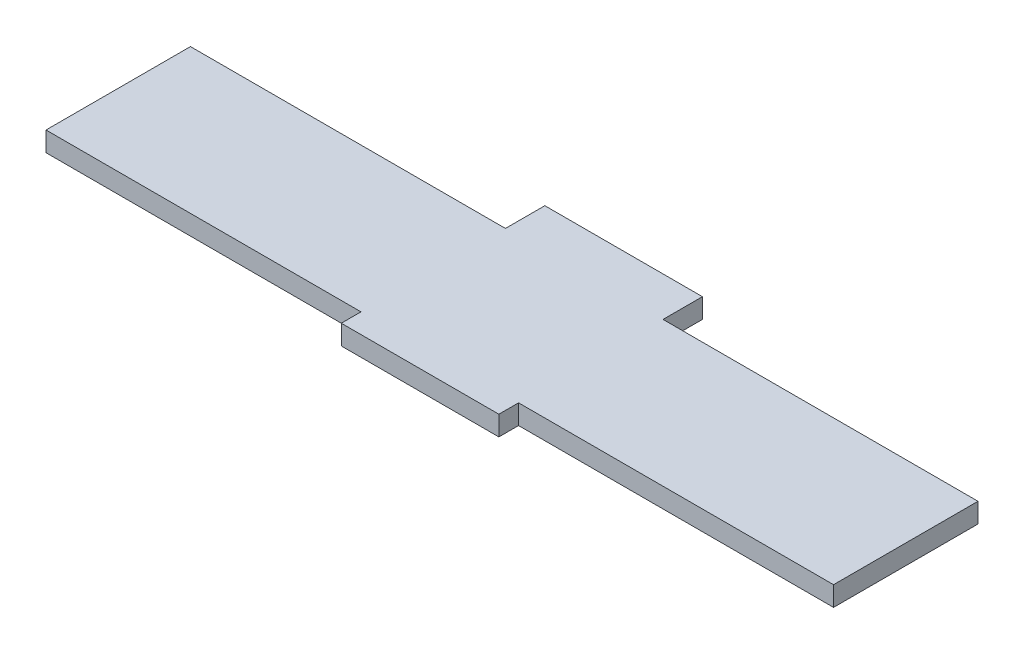
ISO-10303-21;
HEADER;
FILE_DESCRIPTION(('STEP AP214'),'2;1');
FILE_NAME('part.step','',(''),(''),'','','');
FILE_SCHEMA(('AUTOMOTIVE_DESIGN { 1 0 10303 214 1 1 1 1 }'));
ENDSEC;
DATA;
#1=APPLICATION_CONTEXT('core data for automotive mechanical design processes');
#2=APPLICATION_PROTOCOL_DEFINITION('international standard','automotive_design',2000,#1);
#3=PRODUCT_CONTEXT('',#1,'mechanical');
#4=PRODUCT('Part','Part','',(#3));
#5=PRODUCT_RELATED_PRODUCT_CATEGORY('part','',(#4));
#6=PRODUCT_DEFINITION_FORMATION('','',#4);
#7=PRODUCT_DEFINITION_CONTEXT('part definition',#1,'design');
#8=PRODUCT_DEFINITION('design','',#6,#7);
#9=PRODUCT_DEFINITION_SHAPE('','',#8);
#10=(LENGTH_UNIT() NAMED_UNIT(*) SI_UNIT(.MILLI.,.METRE.));
#11=(NAMED_UNIT(*) PLANE_ANGLE_UNIT() SI_UNIT($,.RADIAN.));
#12=(NAMED_UNIT(*) SI_UNIT($,.STERADIAN.) SOLID_ANGLE_UNIT());
#13=UNCERTAINTY_MEASURE_WITH_UNIT(LENGTH_MEASURE(1.E-05),#10,'distance_accuracy_value','');
#14=(GEOMETRIC_REPRESENTATION_CONTEXT(3) GLOBAL_UNCERTAINTY_ASSIGNED_CONTEXT((#13)) GLOBAL_UNIT_ASSIGNED_CONTEXT((#10,
#11,#12)) REPRESENTATION_CONTEXT('',''));
#15=CARTESIAN_POINT('',(0.,0.,0.));
#16=DIRECTION('',(0.,0.,1.));
#17=DIRECTION('',(1.,0.,0.));
#18=AXIS2_PLACEMENT_3D('',#15,#16,#17);
#19=CARTESIAN_POINT('',(-47.9677230243579,3.,0.));
#20=DIRECTION('',(1.,0.,0.));
#21=DIRECTION('',(0.,0.,-1.));
#22=AXIS2_PLACEMENT_3D('',#19,#20,#21);
#23=PLANE('',#22);
#24=DIRECTION('',(0.,0.,1.));
#25=VECTOR('',#24,1.);
#26=CARTESIAN_POINT('',(-47.9677230243579,0.,0.));
#27=LINE('',#26,#25);
#28=CARTESIAN_POINT('',(-47.9677230243579,0.,0.));
#29=VERTEX_POINT('',#28);
#30=CARTESIAN_POINT('',(-47.9677230243579,0.,3.));
#31=VERTEX_POINT('',#30);
#32=EDGE_CURVE('E155',#29,#31,#27,.T.);
#33=ORIENTED_EDGE('',*,*,#32,.F.);
#34=DIRECTION('',(0.,-1.,0.));
#35=VECTOR('',#34,1.);
#36=CARTESIAN_POINT('',(-47.9677230243579,3.,0.));
#37=LINE('',#36,#35);
#38=CARTESIAN_POINT('',(-47.9677230243579,3.,0.));
#39=VERTEX_POINT('',#38);
#40=EDGE_CURVE('E11',#39,#29,#37,.T.);
#41=ORIENTED_EDGE('',*,*,#40,.F.);
#42=DIRECTION('',(0.,0.,1.));
#43=VECTOR('',#42,1.);
#44=CARTESIAN_POINT('',(-47.9677230243579,3.,0.));
#45=LINE('',#44,#43);
#46=CARTESIAN_POINT('',(-47.9677230243579,3.,3.));
#47=VERTEX_POINT('',#46);
#48=EDGE_CURVE('E182',#39,#47,#45,.T.);
#49=ORIENTED_EDGE('',*,*,#48,.T.);
#50=DIRECTION('',(0.,-1.,0.));
#51=VECTOR('',#50,1.);
#52=CARTESIAN_POINT('',(-47.9677230243579,3.,3.));
#53=LINE('',#52,#51);
#54=EDGE_CURVE('E98',#47,#31,#53,.T.);
#55=ORIENTED_EDGE('',*,*,#54,.T.);
#56=EDGE_LOOP('',(#33,#41,#49,#55));
#57=FACE_BOUND('',#56,.T.);
#58=ADVANCED_FACE('F35',(#57),#23,.T.);
#59=CARTESIAN_POINT('',(0.,3.,0.));
#60=DIRECTION('',(0.,0.,-1.));
#61=DIRECTION('',(-1.,0.,0.));
#62=AXIS2_PLACEMENT_3D('',#59,#60,#61);
#63=PLANE('',#62);
#64=DIRECTION('',(1.,0.,0.));
#65=VECTOR('',#64,1.);
#66=CARTESIAN_POINT('',(0.,0.,0.));
#67=LINE('',#66,#65);
#68=CARTESIAN_POINT('',(0.,0.,0.));
#69=VERTEX_POINT('',#68);
#70=EDGE_CURVE('E158',#29,#69,#67,.T.);
#71=ORIENTED_EDGE('',*,*,#70,.T.);
#72=DIRECTION('',(0.,-1.,0.));
#73=VECTOR('',#72,1.);
#74=CARTESIAN_POINT('',(0.,3.,0.));
#75=LINE('',#74,#73);
#76=CARTESIAN_POINT('',(0.,3.,0.));
#77=VERTEX_POINT('',#76);
#78=EDGE_CURVE('E43',#77,#69,#75,.T.);
#79=ORIENTED_EDGE('',*,*,#78,.F.);
#80=DIRECTION('',(1.,0.,0.));
#81=VECTOR('',#80,1.);
#82=CARTESIAN_POINT('',(0.,3.,0.));
#83=LINE('',#82,#81);
#84=EDGE_CURVE('E141',#39,#77,#83,.T.);
#85=ORIENTED_EDGE('',*,*,#84,.F.);
#86=ORIENTED_EDGE('',*,*,#40,.T.);
#87=EDGE_LOOP('',(#71,#79,#85,#86));
#88=FACE_BOUND('',#87,.T.);
#89=ADVANCED_FACE('F206',(#88),#63,.F.);
#90=CARTESIAN_POINT('',(0.,3.,0.));
#91=DIRECTION('',(1.,0.,0.));
#92=DIRECTION('',(0.,0.,-1.));
#93=AXIS2_PLACEMENT_3D('',#90,#91,#92);
#94=PLANE('',#93);
#95=DIRECTION('',(0.,0.,1.));
#96=VECTOR('',#95,1.);
#97=CARTESIAN_POINT('',(0.,0.,0.));
#98=LINE('',#97,#96);
#99=CARTESIAN_POINT('',(0.,0.,-22.));
#100=VERTEX_POINT('',#99);
#101=EDGE_CURVE('E161',#100,#69,#98,.T.);
#102=ORIENTED_EDGE('',*,*,#101,.F.);
#103=DIRECTION('',(0.,-1.,0.));
#104=VECTOR('',#103,1.);
#105=CARTESIAN_POINT('',(0.,3.,-22.));
#106=LINE('',#105,#104);
#107=CARTESIAN_POINT('',(0.,3.,-22.));
#108=VERTEX_POINT('',#107);
#109=EDGE_CURVE('E196',#108,#100,#106,.T.);
#110=ORIENTED_EDGE('',*,*,#109,.F.);
#111=DIRECTION('',(0.,0.,1.));
#112=VECTOR('',#111,1.);
#113=CARTESIAN_POINT('',(0.,3.,0.));
#114=LINE('',#113,#112);
#115=EDGE_CURVE('E203',#108,#77,#114,.T.);
#116=ORIENTED_EDGE('',*,*,#115,.T.);
#117=ORIENTED_EDGE('',*,*,#78,.T.);
#118=EDGE_LOOP('',(#102,#110,#116,#117));
#119=FACE_BOUND('',#118,.T.);
#120=ADVANCED_FACE('F201',(#119),#94,.T.);
#121=CARTESIAN_POINT('',(0.,3.,-22.));
#122=DIRECTION('',(0.,0.,-1.));
#123=DIRECTION('',(-1.,0.,0.));
#124=AXIS2_PLACEMENT_3D('',#121,#122,#123);
#125=PLANE('',#124);
#126=DIRECTION('',(1.,0.,0.));
#127=VECTOR('',#126,1.);
#128=CARTESIAN_POINT('',(0.,0.,-22.));
#129=LINE('',#128,#127);
#130=CARTESIAN_POINT('',(-47.9677230243579,0.,-22.));
#131=VERTEX_POINT('',#130);
#132=EDGE_CURVE('E164',#131,#100,#129,.T.);
#133=ORIENTED_EDGE('',*,*,#132,.F.);
#134=DIRECTION('',(0.,-1.,0.));
#135=VECTOR('',#134,1.);
#136=CARTESIAN_POINT('',(-47.9677230243579,3.,-22.));
#137=LINE('',#136,#135);
#138=CARTESIAN_POINT('',(-47.9677230243579,3.,-22.));
#139=VERTEX_POINT('',#138);
#140=EDGE_CURVE('E194',#139,#131,#137,.T.);
#141=ORIENTED_EDGE('',*,*,#140,.F.);
#142=DIRECTION('',(1.,0.,0.));
#143=VECTOR('',#142,1.);
#144=CARTESIAN_POINT('',(0.,3.,-22.));
#145=LINE('',#144,#143);
#146=EDGE_CURVE('E216',#139,#108,#145,.T.);
#147=ORIENTED_EDGE('',*,*,#146,.T.);
#148=ORIENTED_EDGE('',*,*,#109,.T.);
#149=EDGE_LOOP('',(#133,#141,#147,#148));
#150=FACE_BOUND('',#149,.T.);
#151=ADVANCED_FACE('F212',(#150),#125,.T.);
#152=CARTESIAN_POINT('',(-47.9677230243579,3.,0.));
#153=DIRECTION('',(-1.,0.,0.));
#154=DIRECTION('',(0.,0.,1.));
#155=AXIS2_PLACEMENT_3D('',#152,#153,#154);
#156=PLANE('',#155);
#157=DIRECTION('',(0.,0.,-1.));
#158=VECTOR('',#157,1.);
#159=CARTESIAN_POINT('',(-47.9677230243579,0.,0.));
#160=LINE('',#159,#158);
#161=CARTESIAN_POINT('',(-47.9677230243579,0.,-28.));
#162=VERTEX_POINT('',#161);
#163=EDGE_CURVE('E167',#131,#162,#160,.T.);
#164=ORIENTED_EDGE('',*,*,#163,.T.);
#165=DIRECTION('',(0.,-1.,0.));
#166=VECTOR('',#165,1.);
#167=CARTESIAN_POINT('',(-47.9677230243579,3.,-28.));
#168=LINE('',#167,#166);
#169=CARTESIAN_POINT('',(-47.9677230243579,3.,-28.));
#170=VERTEX_POINT('',#169);
#171=EDGE_CURVE('E192',#170,#162,#168,.T.);
#172=ORIENTED_EDGE('',*,*,#171,.F.);
#173=DIRECTION('',(0.,0.,-1.));
#174=VECTOR('',#173,1.);
#175=CARTESIAN_POINT('',(-47.9677230243579,3.,0.));
#176=LINE('',#175,#174);
#177=EDGE_CURVE('E218',#139,#170,#176,.T.);
#178=ORIENTED_EDGE('',*,*,#177,.F.);
#179=ORIENTED_EDGE('',*,*,#140,.T.);
#180=EDGE_LOOP('',(#164,#172,#178,#179));
#181=FACE_BOUND('',#180,.T.);
#182=ADVANCED_FACE('F324',(#181),#156,.F.);
#183=CARTESIAN_POINT('',(0.,3.,-28.));
#184=DIRECTION('',(0.,0.,-1.));
#185=DIRECTION('',(-1.,0.,0.));
#186=AXIS2_PLACEMENT_3D('',#183,#184,#185);
#187=PLANE('',#186);
#188=DIRECTION('',(1.,0.,0.));
#189=VECTOR('',#188,1.);
#190=CARTESIAN_POINT('',(0.,0.,-28.));
#191=LINE('',#190,#189);
#192=CARTESIAN_POINT('',(-71.9677230243579,0.,-28.));
#193=VERTEX_POINT('',#192);
#194=EDGE_CURVE('E171',#193,#162,#191,.T.);
#195=ORIENTED_EDGE('',*,*,#194,.F.);
#196=DIRECTION('',(0.,-1.,0.));
#197=VECTOR('',#196,1.);
#198=CARTESIAN_POINT('',(-71.9677230243579,3.,-28.));
#199=LINE('',#198,#197);
#200=CARTESIAN_POINT('',(-71.9677230243579,3.,-28.));
#201=VERTEX_POINT('',#200);
#202=EDGE_CURVE('E190',#201,#193,#199,.T.);
#203=ORIENTED_EDGE('',*,*,#202,.F.);
#204=DIRECTION('',(1.,0.,0.));
#205=VECTOR('',#204,1.);
#206=CARTESIAN_POINT('',(0.,3.,-28.));
#207=LINE('',#206,#205);
#208=EDGE_CURVE('E224',#201,#170,#207,.T.);
#209=ORIENTED_EDGE('',*,*,#208,.T.);
#210=ORIENTED_EDGE('',*,*,#171,.T.);
#211=EDGE_LOOP('',(#195,#203,#209,#210));
#212=FACE_BOUND('',#211,.T.);
#213=ADVANCED_FACE('F239',(#212),#187,.T.);
#214=CARTESIAN_POINT('',(-71.9677230243579,3.,0.));
#215=DIRECTION('',(-1.,0.,0.));
#216=DIRECTION('',(0.,0.,1.));
#217=AXIS2_PLACEMENT_3D('',#214,#215,#216);
#218=PLANE('',#217);
#219=DIRECTION('',(0.,0.,-1.));
#220=VECTOR('',#219,1.);
#221=CARTESIAN_POINT('',(-71.9677230243579,0.,0.));
#222=LINE('',#221,#220);
#223=CARTESIAN_POINT('',(-71.9677230243579,0.,-22.));
#224=VERTEX_POINT('',#223);
#225=EDGE_CURVE('E174',#224,#193,#222,.T.);
#226=ORIENTED_EDGE('',*,*,#225,.F.);
#227=DIRECTION('',(0.,-1.,0.));
#228=VECTOR('',#227,1.);
#229=CARTESIAN_POINT('',(-71.9677230243579,3.,-22.));
#230=LINE('',#229,#228);
#231=CARTESIAN_POINT('',(-71.9677230243579,3.,-22.));
#232=VERTEX_POINT('',#231);
#233=EDGE_CURVE('E188',#232,#224,#230,.T.);
#234=ORIENTED_EDGE('',*,*,#233,.F.);
#235=DIRECTION('',(0.,0.,-1.));
#236=VECTOR('',#235,1.);
#237=CARTESIAN_POINT('',(-71.9677230243579,3.,0.));
#238=LINE('',#237,#236);
#239=EDGE_CURVE('E226',#232,#201,#238,.T.);
#240=ORIENTED_EDGE('',*,*,#239,.T.);
#241=ORIENTED_EDGE('',*,*,#202,.T.);
#242=EDGE_LOOP('',(#226,#234,#240,#241));
#243=FACE_BOUND('',#242,.T.);
#244=ADVANCED_FACE('F240',(#243),#218,.T.);
#245=CARTESIAN_POINT('',(-119.935446048716,0.,-22.));
#246=VERTEX_POINT('',#245);
#247=EDGE_CURVE('E168',#246,#224,#129,.T.);
#248=ORIENTED_EDGE('',*,*,#247,.F.);
#249=DIRECTION('',(0.,-1.,0.));
#250=VECTOR('',#249,1.);
#251=CARTESIAN_POINT('',(-119.935446048716,3.,-22.));
#252=LINE('',#251,#250);
#253=CARTESIAN_POINT('',(-119.935446048716,3.,-22.));
#254=VERTEX_POINT('',#253);
#255=EDGE_CURVE('E186',#254,#246,#252,.T.);
#256=ORIENTED_EDGE('',*,*,#255,.F.);
#257=EDGE_CURVE('E220',#254,#232,#145,.T.);
#258=ORIENTED_EDGE('',*,*,#257,.T.);
#259=ORIENTED_EDGE('',*,*,#233,.T.);
#260=EDGE_LOOP('',(#248,#256,#258,#259));
#261=FACE_BOUND('',#260,.T.);
#262=ADVANCED_FACE('F233',(#261),#125,.T.);
#263=CARTESIAN_POINT('',(-119.935446048716,3.,0.));
#264=DIRECTION('',(1.,0.,0.));
#265=DIRECTION('',(0.,0.,-1.));
#266=AXIS2_PLACEMENT_3D('',#263,#264,#265);
#267=PLANE('',#266);
#268=DIRECTION('',(0.,0.,1.));
#269=VECTOR('',#268,1.);
#270=CARTESIAN_POINT('',(-119.935446048716,0.,0.));
#271=LINE('',#270,#269);
#272=CARTESIAN_POINT('',(-119.935446048716,0.,0.));
#273=VERTEX_POINT('',#272);
#274=EDGE_CURVE('E177',#246,#273,#271,.T.);
#275=ORIENTED_EDGE('',*,*,#274,.T.);
#276=DIRECTION('',(0.,-1.,0.));
#277=VECTOR('',#276,1.);
#278=CARTESIAN_POINT('',(-119.935446048716,3.,0.));
#279=LINE('',#278,#277);
#280=CARTESIAN_POINT('',(-119.935446048716,3.,0.));
#281=VERTEX_POINT('',#280);
#282=EDGE_CURVE('E146',#281,#273,#279,.T.);
#283=ORIENTED_EDGE('',*,*,#282,.F.);
#284=DIRECTION('',(0.,0.,1.));
#285=VECTOR('',#284,1.);
#286=CARTESIAN_POINT('',(-119.935446048716,3.,0.));
#287=LINE('',#286,#285);
#288=EDGE_CURVE('E136',#254,#281,#287,.T.);
#289=ORIENTED_EDGE('',*,*,#288,.F.);
#290=ORIENTED_EDGE('',*,*,#255,.T.);
#291=EDGE_LOOP('',(#275,#283,#289,#290));
#292=FACE_BOUND('',#291,.T.);
#293=ADVANCED_FACE('F244',(#292),#267,.F.);
#294=CARTESIAN_POINT('',(-71.9677230243579,0.,0.));
#295=VERTEX_POINT('',#294);
#296=EDGE_CURVE('E145',#273,#295,#67,.T.);
#297=ORIENTED_EDGE('',*,*,#296,.T.);
#298=DIRECTION('',(0.,-1.,0.));
#299=VECTOR('',#298,1.);
#300=CARTESIAN_POINT('',(-71.9677230243579,3.,0.));
#301=LINE('',#300,#299);
#302=CARTESIAN_POINT('',(-71.9677230243579,3.,0.));
#303=VERTEX_POINT('',#302);
#304=EDGE_CURVE('E142',#303,#295,#301,.T.);
#305=ORIENTED_EDGE('',*,*,#304,.F.);
#306=EDGE_CURVE('E129',#281,#303,#83,.T.);
#307=ORIENTED_EDGE('',*,*,#306,.F.);
#308=ORIENTED_EDGE('',*,*,#282,.T.);
#309=EDGE_LOOP('',(#297,#305,#307,#308));
#310=FACE_BOUND('',#309,.T.);
#311=ADVANCED_FACE('F143',(#310),#63,.F.);
#312=CARTESIAN_POINT('',(-71.9677230243579,3.,0.));
#313=DIRECTION('',(1.,0.,0.));
#314=DIRECTION('',(0.,0.,-1.));
#315=AXIS2_PLACEMENT_3D('',#312,#313,#314);
#316=PLANE('',#315);
#317=DIRECTION('',(0.,0.,1.));
#318=VECTOR('',#317,1.);
#319=CARTESIAN_POINT('',(-71.9677230243579,0.,0.));
#320=LINE('',#319,#318);
#321=CARTESIAN_POINT('',(-71.9677230243579,0.,3.));
#322=VERTEX_POINT('',#321);
#323=EDGE_CURVE('E91',#295,#322,#320,.T.);
#324=ORIENTED_EDGE('',*,*,#323,.T.);
#325=DIRECTION('',(0.,-1.,0.));
#326=VECTOR('',#325,1.);
#327=CARTESIAN_POINT('',(-71.9677230243579,3.,3.));
#328=LINE('',#327,#326);
#329=CARTESIAN_POINT('',(-71.9677230243579,3.,3.));
#330=VERTEX_POINT('',#329);
#331=EDGE_CURVE('E147',#330,#322,#328,.T.);
#332=ORIENTED_EDGE('',*,*,#331,.F.);
#333=DIRECTION('',(0.,0.,1.));
#334=VECTOR('',#333,1.);
#335=CARTESIAN_POINT('',(-71.9677230243579,3.,0.));
#336=LINE('',#335,#334);
#337=EDGE_CURVE('E133',#303,#330,#336,.T.);
#338=ORIENTED_EDGE('',*,*,#337,.F.);
#339=ORIENTED_EDGE('',*,*,#304,.T.);
#340=EDGE_LOOP('',(#324,#332,#338,#339));
#341=FACE_BOUND('',#340,.T.);
#342=ADVANCED_FACE('F149',(#341),#316,.F.);
#343=CARTESIAN_POINT('',(0.,3.,2.99999999999999));
#344=DIRECTION('',(0.,0.,-1.));
#345=DIRECTION('',(-1.,0.,0.));
#346=AXIS2_PLACEMENT_3D('',#343,#344,#345);
#347=PLANE('',#346);
#348=DIRECTION('',(1.,0.,0.));
#349=VECTOR('',#348,1.);
#350=CARTESIAN_POINT('',(0.,0.,2.99999999999999));
#351=LINE('',#350,#349);
#352=EDGE_CURVE('E180',#322,#31,#351,.T.);
#353=ORIENTED_EDGE('',*,*,#352,.T.);
#354=ORIENTED_EDGE('',*,*,#54,.F.);
#355=DIRECTION('',(1.,0.,0.));
#356=VECTOR('',#355,1.);
#357=CARTESIAN_POINT('',(0.,3.,2.99999999999999));
#358=LINE('',#357,#356);
#359=EDGE_CURVE('E51',#330,#47,#358,.T.);
#360=ORIENTED_EDGE('',*,*,#359,.F.);
#361=ORIENTED_EDGE('',*,*,#331,.T.);
#362=EDGE_LOOP('',(#353,#354,#360,#361));
#363=FACE_BOUND('',#362,.T.);
#364=ADVANCED_FACE('F259',(#363),#347,.F.);
#365=CARTESIAN_POINT('',(0.,3.,0.));
#366=DIRECTION('',(0.,1.,0.));
#367=DIRECTION('',(0.,0.,1.));
#368=AXIS2_PLACEMENT_3D('',#365,#366,#367);
#369=PLANE('',#368);
#370=ORIENTED_EDGE('',*,*,#48,.F.);
#371=ORIENTED_EDGE('',*,*,#84,.T.);
#372=ORIENTED_EDGE('',*,*,#115,.F.);
#373=ORIENTED_EDGE('',*,*,#146,.F.);
#374=ORIENTED_EDGE('',*,*,#177,.T.);
#375=ORIENTED_EDGE('',*,*,#208,.F.);
#376=ORIENTED_EDGE('',*,*,#239,.F.);
#377=ORIENTED_EDGE('',*,*,#257,.F.);
#378=ORIENTED_EDGE('',*,*,#288,.T.);
#379=ORIENTED_EDGE('',*,*,#306,.T.);
#380=ORIENTED_EDGE('',*,*,#337,.T.);
#381=ORIENTED_EDGE('',*,*,#359,.T.);
#382=EDGE_LOOP('',(#370,#371,#372,#373,#374,#375,#376,#377,#378,#379,#380,#381));
#383=FACE_BOUND('',#382,.T.);
#384=ADVANCED_FACE('F131',(#383),#369,.T.);
#385=CARTESIAN_POINT('',(0.,0.,0.));
#386=DIRECTION('',(0.,1.,0.));
#387=DIRECTION('',(0.,0.,1.));
#388=AXIS2_PLACEMENT_3D('',#385,#386,#387);
#389=PLANE('',#388);
#390=ORIENTED_EDGE('',*,*,#32,.T.);
#391=ORIENTED_EDGE('',*,*,#352,.F.);
#392=ORIENTED_EDGE('',*,*,#323,.F.);
#393=ORIENTED_EDGE('',*,*,#296,.F.);
#394=ORIENTED_EDGE('',*,*,#274,.F.);
#395=ORIENTED_EDGE('',*,*,#247,.T.);
#396=ORIENTED_EDGE('',*,*,#225,.T.);
#397=ORIENTED_EDGE('',*,*,#194,.T.);
#398=ORIENTED_EDGE('',*,*,#163,.F.);
#399=ORIENTED_EDGE('',*,*,#132,.T.);
#400=ORIENTED_EDGE('',*,*,#101,.T.);
#401=ORIENTED_EDGE('',*,*,#70,.F.);
#402=EDGE_LOOP('',(#390,#391,#392,#393,#394,#395,#396,#397,#398,#399,#400,#401));
#403=FACE_BOUND('',#402,.T.);
#404=ADVANCED_FACE('F208',(#403),#389,.F.);
#405=CLOSED_SHELL('',(#58,#89,#120,#151,#182,#213,#244,#262,#293,#311,#342,#364,#384,#404));
#406=MANIFOLD_SOLID_BREP('B2',#405);
#407=ADVANCED_BREP_SHAPE_REPRESENTATION('',(#18,#406),#14);
#408=SHAPE_DEFINITION_REPRESENTATION(#9,#407);
ENDSEC;
END-ISO-10303-21;
